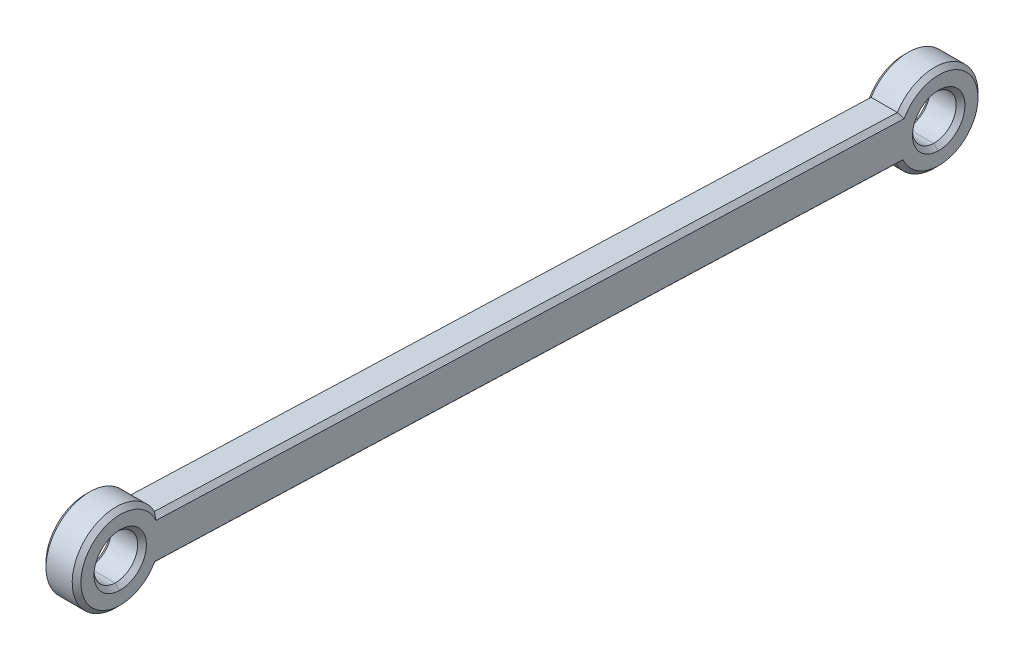
ISO-10303-21;
HEADER;
FILE_DESCRIPTION(('STEP AP214'),'2;1');
FILE_NAME('part.step','',(''),(''),'','','');
FILE_SCHEMA(('AUTOMOTIVE_DESIGN { 1 0 10303 214 1 1 1 1 }'));
ENDSEC;
DATA;
#1=APPLICATION_CONTEXT('core data for automotive mechanical design processes');
#2=APPLICATION_PROTOCOL_DEFINITION('international standard','automotive_design',2000,#1);
#3=PRODUCT_CONTEXT('',#1,'mechanical');
#4=PRODUCT('Part','Part','',(#3));
#5=PRODUCT_RELATED_PRODUCT_CATEGORY('part','',(#4));
#6=PRODUCT_DEFINITION_FORMATION('','',#4);
#7=PRODUCT_DEFINITION_CONTEXT('part definition',#1,'design');
#8=PRODUCT_DEFINITION('design','',#6,#7);
#9=PRODUCT_DEFINITION_SHAPE('','',#8);
#10=(LENGTH_UNIT() NAMED_UNIT(*) SI_UNIT(.MILLI.,.METRE.));
#11=(NAMED_UNIT(*) PLANE_ANGLE_UNIT() SI_UNIT($,.RADIAN.));
#12=(NAMED_UNIT(*) SI_UNIT($,.STERADIAN.) SOLID_ANGLE_UNIT());
#13=UNCERTAINTY_MEASURE_WITH_UNIT(LENGTH_MEASURE(1.E-05),#10,'distance_accuracy_value','');
#14=(GEOMETRIC_REPRESENTATION_CONTEXT(3) GLOBAL_UNCERTAINTY_ASSIGNED_CONTEXT((#13)) GLOBAL_UNIT_ASSIGNED_CONTEXT((#10,
#11,#12)) REPRESENTATION_CONTEXT('',''));
#15=CARTESIAN_POINT('',(0.,0.,0.));
#16=DIRECTION('',(0.,0.,1.));
#17=DIRECTION('',(1.,0.,0.));
#18=AXIS2_PLACEMENT_3D('',#15,#16,#17);
#19=CARTESIAN_POINT('',(108.5,18.26837005561,-729.2475213463));
#20=DIRECTION('',(1.,0.,0.));
#21=DIRECTION('',(0.,-0.999390827019096,0.0348994967024998));
#22=AXIS2_PLACEMENT_3D('',#19,#20,#21);
#23=CONICAL_SURFACE('',#22,5.5,0.7853981633973);
#24=DIRECTION('',(-0.707106781186443,0.706676030840843,-0.0246776707811115));
#25=VECTOR('',#24,1.);
#26=CARTESIAN_POINT('',(109.,12.2720250935,-729.0381243661));
#27=LINE('',#26,#25);
#28=CARTESIAN_POINT('',(109.,12.2720250935,-729.0381243661));
#29=VERTEX_POINT('',#28);
#30=CARTESIAN_POINT('',(108.,13.27141592051,-729.0730238628));
#31=VERTEX_POINT('',#30);
#32=EDGE_CURVE('E10',#29,#31,#27,.T.);
#33=ORIENTED_EDGE('',*,*,#32,.T.);
#34=CARTESIAN_POINT('',(108.,18.26837005561,-729.2475213463));
#35=DIRECTION('',(1.,0.,0.));
#36=DIRECTION('',(0.,0.999390827019096,-0.0348994967024998));
#37=AXIS2_PLACEMENT_3D('',#34,#35,#36);
#38=CIRCLE('',#37,5.);
#39=CARTESIAN_POINT('',(108.,23.26532419071,-729.4220188298));
#40=VERTEX_POINT('',#39);
#41=EDGE_CURVE('E214',#40,#31,#38,.T.);
#42=ORIENTED_EDGE('',*,*,#41,.F.);
#43=DIRECTION('',(-0.707106781186415,-0.706676030841115,0.0246776707741205));
#44=VECTOR('',#43,1.);
#45=CARTESIAN_POINT('',(109.,24.26471501773,-729.4569183265));
#46=LINE('',#45,#44);
#47=CARTESIAN_POINT('',(109.,24.26471501772,-729.4569183265));
#48=VERTEX_POINT('',#47);
#49=EDGE_CURVE('E25',#48,#40,#46,.T.);
#50=ORIENTED_EDGE('',*,*,#49,.F.);
#51=CARTESIAN_POINT('',(109.,18.26837005561,-729.2475213463));
#52=DIRECTION('',(1.,0.,0.));
#53=DIRECTION('',(0.,0.99939082701914,-0.0348994967012414));
#54=AXIS2_PLACEMENT_3D('',#51,#52,#53);
#55=CIRCLE('',#54,6.);
#56=EDGE_CURVE('E628',#48,#29,#55,.T.);
#57=ORIENTED_EDGE('',*,*,#56,.T.);
#58=EDGE_LOOP('',(#33,#42,#50,#57));
#59=FACE_BOUND('',#58,.T.);
#60=ADVANCED_FACE('F15',(#59),#23,.F.);
#61=CARTESIAN_POINT('',(108.5,18.26837005561,-729.2475213463));
#62=DIRECTION('',(1.,0.,0.));
#63=DIRECTION('',(0.,-0.999390827019096,0.0348994967024998));
#64=AXIS2_PLACEMENT_3D('',#61,#62,#63);
#65=CONICAL_SURFACE('',#64,5.5,0.7853981633973);
#66=ORIENTED_EDGE('',*,*,#49,.T.);
#67=CARTESIAN_POINT('',(108.,18.26837005561,-729.2475213463));
#68=DIRECTION('',(1.,0.,0.));
#69=DIRECTION('',(0.,-0.999390827019182,0.0348994967000194));
#70=AXIS2_PLACEMENT_3D('',#67,#68,#69);
#71=CIRCLE('',#70,5.);
#72=EDGE_CURVE('E212',#31,#40,#71,.T.);
#73=ORIENTED_EDGE('',*,*,#72,.F.);
#74=ORIENTED_EDGE('',*,*,#32,.F.);
#75=CARTESIAN_POINT('',(109.,18.26837005561,-729.2475213463));
#76=DIRECTION('',(1.,0.,0.));
#77=DIRECTION('',(0.,-0.999390827019138,0.0348994967012813));
#78=AXIS2_PLACEMENT_3D('',#75,#76,#77);
#79=CIRCLE('',#78,6.);
#80=EDGE_CURVE('E643',#29,#48,#79,.T.);
#81=ORIENTED_EDGE('',*,*,#80,.T.);
#82=EDGE_LOOP('',(#66,#73,#74,#81));
#83=FACE_BOUND('',#82,.T.);
#84=ADVANCED_FACE('F776',(#83),#65,.F.);
#85=CARTESIAN_POINT('',(109.,18.26837005561,-729.2475213463));
#86=DIRECTION('',(-1.,0.,0.));
#87=DIRECTION('',(0.,0.999390827019096,-0.0348994967024998));
#88=AXIS2_PLACEMENT_3D('',#85,#86,#87);
#89=CYLINDRICAL_SURFACE('',#88,5.);
#90=DIRECTION('',(1.,0.,9.473903143468E-13));
#91=VECTOR('',#90,1.);
#92=CARTESIAN_POINT('',(102.,13.27141592051,-729.0730238628));
#93=LINE('',#92,#91);
#94=CARTESIAN_POINT('',(102.,13.27141592051,-729.0730238628));
#95=VERTEX_POINT('',#94);
#96=EDGE_CURVE('E198',#95,#31,#93,.T.);
#97=ORIENTED_EDGE('',*,*,#96,.T.);
#98=ORIENTED_EDGE('',*,*,#72,.T.);
#99=DIRECTION('',(1.,0.,9.473903143468E-13));
#100=VECTOR('',#99,1.);
#101=CARTESIAN_POINT('',(102.,23.26532419071,-729.4220188298));
#102=LINE('',#101,#100);
#103=CARTESIAN_POINT('',(102.,23.26532419071,-729.4220188298));
#104=VERTEX_POINT('',#103);
#105=EDGE_CURVE('E207',#104,#40,#102,.T.);
#106=ORIENTED_EDGE('',*,*,#105,.F.);
#107=CARTESIAN_POINT('',(102.,18.26837005561,-729.2475213463));
#108=DIRECTION('',(-1.,0.,0.));
#109=DIRECTION('',(0.,0.999390827019096,-0.0348994967024998));
#110=AXIS2_PLACEMENT_3D('',#107,#108,#109);
#111=CIRCLE('',#110,5.);
#112=EDGE_CURVE('E210',#104,#95,#111,.T.);
#113=ORIENTED_EDGE('',*,*,#112,.T.);
#114=EDGE_LOOP('',(#97,#98,#106,#113));
#115=FACE_BOUND('',#114,.T.);
#116=ADVANCED_FACE('F208',(#115),#89,.F.);
#117=CARTESIAN_POINT('',(109.,18.26837005561,-729.2475213463));
#118=DIRECTION('',(-1.,0.,0.));
#119=DIRECTION('',(0.,0.999390827019096,-0.0348994967024998));
#120=AXIS2_PLACEMENT_3D('',#117,#118,#119);
#121=CYLINDRICAL_SURFACE('',#120,5.);
#122=ORIENTED_EDGE('',*,*,#105,.T.);
#123=ORIENTED_EDGE('',*,*,#41,.T.);
#124=ORIENTED_EDGE('',*,*,#96,.F.);
#125=CARTESIAN_POINT('',(102.,18.26837005561,-729.2475213463));
#126=DIRECTION('',(-1.,0.,0.));
#127=DIRECTION('',(0.,-0.999390827019182,0.0348994967000194));
#128=AXIS2_PLACEMENT_3D('',#125,#126,#127);
#129=CIRCLE('',#128,5.);
#130=EDGE_CURVE('E215',#95,#104,#129,.T.);
#131=ORIENTED_EDGE('',*,*,#130,.T.);
#132=EDGE_LOOP('',(#122,#123,#124,#131));
#133=FACE_BOUND('',#132,.T.);
#134=ADVANCED_FACE('F218',(#133),#121,.F.);
#135=CARTESIAN_POINT('',(101.5,18.26837005561,-729.2475213463));
#136=DIRECTION('',(-1.,0.,0.));
#137=DIRECTION('',(0.,0.999390827019096,-0.0348994967024998));
#138=AXIS2_PLACEMENT_3D('',#135,#136,#137);
#139=CONICAL_SURFACE('',#138,5.5,0.7853981633973);
#140=DIRECTION('',(0.70710678118667,-0.70667603084077,0.024677670776699));
#141=VECTOR('',#140,1.);
#142=CARTESIAN_POINT('',(101.,24.26471501772,-729.4569183265));
#143=LINE('',#142,#141);
#144=CARTESIAN_POINT('',(101.,24.26471501772,-729.4569183265));
#145=VERTEX_POINT('',#144);
#146=EDGE_CURVE('E221',#145,#104,#143,.T.);
#147=ORIENTED_EDGE('',*,*,#146,.T.);
#148=ORIENTED_EDGE('',*,*,#130,.F.);
#149=DIRECTION('',(0.707106781186686,0.706676030840686,-0.0246776707786295));
#150=VECTOR('',#149,1.);
#151=CARTESIAN_POINT('',(101.,12.2720250935,-729.0381243661));
#152=LINE('',#151,#150);
#153=CARTESIAN_POINT('',(101.,12.2720250935,-729.0381243661));
#154=VERTEX_POINT('',#153);
#155=EDGE_CURVE('E233',#154,#95,#152,.T.);
#156=ORIENTED_EDGE('',*,*,#155,.F.);
#157=CARTESIAN_POINT('',(101.,18.26837005561,-729.2475213463));
#158=DIRECTION('',(-1.,0.,0.));
#159=DIRECTION('',(0.,-0.999390827019138,0.0348994967012813));
#160=AXIS2_PLACEMENT_3D('',#157,#158,#159);
#161=CIRCLE('',#160,6.);
#162=EDGE_CURVE('E226',#154,#145,#161,.T.);
#163=ORIENTED_EDGE('',*,*,#162,.T.);
#164=EDGE_LOOP('',(#147,#148,#156,#163));
#165=FACE_BOUND('',#164,.T.);
#166=ADVANCED_FACE('F224',(#165),#139,.F.);
#167=CARTESIAN_POINT('',(101.5,18.26837005561,-729.2475213463));
#168=DIRECTION('',(-1.,0.,0.));
#169=DIRECTION('',(0.,0.999390827019096,-0.0348994967024998));
#170=AXIS2_PLACEMENT_3D('',#167,#168,#169);
#171=CONICAL_SURFACE('',#170,5.5,0.7853981633973);
#172=ORIENTED_EDGE('',*,*,#155,.T.);
#173=ORIENTED_EDGE('',*,*,#112,.F.);
#174=ORIENTED_EDGE('',*,*,#146,.F.);
#175=CARTESIAN_POINT('',(101.,18.26837005561,-729.2475213463));
#176=DIRECTION('',(-1.,0.,0.));
#177=DIRECTION('',(0.,0.99939082701914,-0.0348994967012414));
#178=AXIS2_PLACEMENT_3D('',#175,#176,#177);
#179=CIRCLE('',#178,6.);
#180=EDGE_CURVE('E658',#145,#154,#179,.T.);
#181=ORIENTED_EDGE('',*,*,#180,.T.);
#182=EDGE_LOOP('',(#172,#173,#174,#181));
#183=FACE_BOUND('',#182,.T.);
#184=ADVANCED_FACE('F232',(#183),#171,.F.);
#185=CARTESIAN_POINT('',(108.5,24.815515637,-541.7618021975));
#186=DIRECTION('',(1.,0.,0.));
#187=DIRECTION('',(0.,-0.999390827019096,0.0348994967024998));
#188=AXIS2_PLACEMENT_3D('',#185,#186,#187);
#189=CONICAL_SURFACE('',#188,5.5,0.7853981633973);
#190=DIRECTION('',(-0.707106781186397,0.706676030840897,-0.0246776707808699));
#191=VECTOR('',#190,1.);
#192=CARTESIAN_POINT('',(109.,18.81917067489,-541.5524052173));
#193=LINE('',#192,#191);
#194=CARTESIAN_POINT('',(109.,18.81917067489,-541.5524052173));
#195=VERTEX_POINT('',#194);
#196=CARTESIAN_POINT('',(108.,19.8185615019,-541.587304714));
#197=VERTEX_POINT('',#196);
#198=EDGE_CURVE('E718',#195,#197,#193,.T.);
#199=ORIENTED_EDGE('',*,*,#198,.T.);
#200=CARTESIAN_POINT('',(108.,24.815515637,-541.7618021975));
#201=DIRECTION('',(1.,0.,0.));
#202=DIRECTION('',(0.,0.999390827019096,-0.0348994967024998));
#203=AXIS2_PLACEMENT_3D('',#200,#201,#202);
#204=CIRCLE('',#203,5.);
#205=CARTESIAN_POINT('',(108.,29.8124697721,-541.936299681));
#206=VERTEX_POINT('',#205);
#207=EDGE_CURVE('E693',#206,#197,#204,.T.);
#208=ORIENTED_EDGE('',*,*,#207,.F.);
#209=DIRECTION('',(-0.707106781186415,-0.706676030841115,0.0246776707741205));
#210=VECTOR('',#209,1.);
#211=CARTESIAN_POINT('',(109.,30.81186059912,-541.9711991777));
#212=LINE('',#211,#210);
#213=CARTESIAN_POINT('',(109.,30.81186059911,-541.9711991777));
#214=VERTEX_POINT('',#213);
#215=EDGE_CURVE('E727',#214,#206,#212,.T.);
#216=ORIENTED_EDGE('',*,*,#215,.F.);
#217=CARTESIAN_POINT('',(109.,24.815515637,-541.7618021975));
#218=DIRECTION('',(1.,0.,0.));
#219=DIRECTION('',(0.,0.999390827019138,-0.0348994967012813));
#220=AXIS2_PLACEMENT_3D('',#217,#218,#219);
#221=CIRCLE('',#220,6.);
#222=EDGE_CURVE('E292',#214,#195,#221,.T.);
#223=ORIENTED_EDGE('',*,*,#222,.T.);
#224=EDGE_LOOP('',(#199,#208,#216,#223));
#225=FACE_BOUND('',#224,.T.);
#226=ADVANCED_FACE('F719',(#225),#189,.F.);
#227=CARTESIAN_POINT('',(109.,24.815515637,-541.7618021975));
#228=DIRECTION('',(-1.,0.,0.));
#229=DIRECTION('',(0.,0.999390827019096,-0.0348994967024998));
#230=AXIS2_PLACEMENT_3D('',#227,#228,#229);
#231=CYLINDRICAL_SURFACE('',#230,5.);
#232=DIRECTION('',(1.,0.,9.094947017729E-13));
#233=VECTOR('',#232,1.);
#234=CARTESIAN_POINT('',(102.,19.8185615019,-541.587304714));
#235=LINE('',#234,#233);
#236=CARTESIAN_POINT('',(102.,19.8185615019,-541.587304714));
#237=VERTEX_POINT('',#236);
#238=EDGE_CURVE('E239',#237,#197,#235,.T.);
#239=ORIENTED_EDGE('',*,*,#238,.T.);
#240=CARTESIAN_POINT('',(108.,24.815515637,-541.7618021975));
#241=DIRECTION('',(1.,0.,0.));
#242=DIRECTION('',(0.,-0.999390827019181,0.0348994967000593));
#243=AXIS2_PLACEMENT_3D('',#240,#241,#242);
#244=CIRCLE('',#243,5.);
#245=EDGE_CURVE('E705',#197,#206,#244,.T.);
#246=ORIENTED_EDGE('',*,*,#245,.T.);
#247=DIRECTION('',(1.,0.,9.473903143468E-13));
#248=VECTOR('',#247,1.);
#249=CARTESIAN_POINT('',(102.,29.8124697721,-541.936299681));
#250=LINE('',#249,#248);
#251=CARTESIAN_POINT('',(102.,29.8124697721,-541.936299681));
#252=VERTEX_POINT('',#251);
#253=EDGE_CURVE('E689',#252,#206,#250,.T.);
#254=ORIENTED_EDGE('',*,*,#253,.F.);
#255=CARTESIAN_POINT('',(102.,24.815515637,-541.7618021975));
#256=DIRECTION('',(-1.,0.,0.));
#257=DIRECTION('',(0.,0.999390827019096,-0.0348994967024998));
#258=AXIS2_PLACEMENT_3D('',#255,#256,#257);
#259=CIRCLE('',#258,5.);
#260=EDGE_CURVE('E677',#252,#237,#259,.T.);
#261=ORIENTED_EDGE('',*,*,#260,.T.);
#262=EDGE_LOOP('',(#239,#246,#254,#261));
#263=FACE_BOUND('',#262,.T.);
#264=ADVANCED_FACE('F702',(#263),#231,.F.);
#265=CARTESIAN_POINT('',(109.,24.815515637,-541.7618021975));
#266=DIRECTION('',(-1.,0.,0.));
#267=DIRECTION('',(0.,0.999390827019096,-0.0348994967024998));
#268=AXIS2_PLACEMENT_3D('',#265,#266,#267);
#269=CYLINDRICAL_SURFACE('',#268,5.);
#270=ORIENTED_EDGE('',*,*,#253,.T.);
#271=ORIENTED_EDGE('',*,*,#207,.T.);
#272=ORIENTED_EDGE('',*,*,#238,.F.);
#273=CARTESIAN_POINT('',(102.,24.815515637,-541.7618021975));
#274=DIRECTION('',(-1.,0.,0.));
#275=DIRECTION('',(0.,-0.999390827019181,0.0348994967000593));
#276=AXIS2_PLACEMENT_3D('',#273,#274,#275);
#277=CIRCLE('',#276,5.);
#278=EDGE_CURVE('E685',#237,#252,#277,.T.);
#279=ORIENTED_EDGE('',*,*,#278,.T.);
#280=EDGE_LOOP('',(#270,#271,#272,#279));
#281=FACE_BOUND('',#280,.T.);
#282=ADVANCED_FACE('F445',(#281),#269,.F.);
#283=CARTESIAN_POINT('',(101.5,24.815515637,-541.7618021975));
#284=DIRECTION('',(-1.,0.,0.));
#285=DIRECTION('',(0.,0.999390827019096,-0.0348994967024998));
#286=AXIS2_PLACEMENT_3D('',#283,#284,#285);
#287=CONICAL_SURFACE('',#286,5.5,0.7853981633973);
#288=DIRECTION('',(0.707106781186671,-0.706676030840771,0.024677670776619));
#289=VECTOR('',#288,1.);
#290=CARTESIAN_POINT('',(101.,30.81186059911,-541.9711991777));
#291=LINE('',#290,#289);
#292=CARTESIAN_POINT('',(101.,30.81186059911,-541.9711991777));
#293=VERTEX_POINT('',#292);
#294=EDGE_CURVE('E681',#293,#252,#291,.T.);
#295=ORIENTED_EDGE('',*,*,#294,.T.);
#296=ORIENTED_EDGE('',*,*,#278,.F.);
#297=DIRECTION('',(0.707106781186687,0.706676030840687,-0.0246776707785495));
#298=VECTOR('',#297,1.);
#299=CARTESIAN_POINT('',(101.,18.81917067489,-541.5524052173));
#300=LINE('',#299,#298);
#301=CARTESIAN_POINT('',(101.,18.81917067489,-541.5524052173));
#302=VERTEX_POINT('',#301);
#303=EDGE_CURVE('E363',#302,#237,#300,.T.);
#304=ORIENTED_EDGE('',*,*,#303,.F.);
#305=CARTESIAN_POINT('',(101.,24.815515637,-541.7618021975));
#306=DIRECTION('',(-1.,0.,0.));
#307=DIRECTION('',(0.,-0.99939082701914,0.0348994967012414));
#308=AXIS2_PLACEMENT_3D('',#305,#306,#307);
#309=CIRCLE('',#308,6.);
#310=EDGE_CURVE('E463',#302,#293,#309,.T.);
#311=ORIENTED_EDGE('',*,*,#310,.T.);
#312=EDGE_LOOP('',(#295,#296,#304,#311));
#313=FACE_BOUND('',#312,.T.);
#314=ADVANCED_FACE('F507',(#313),#287,.F.);
#315=CARTESIAN_POINT('',(101.5,24.815515637,-541.7618021975));
#316=DIRECTION('',(-1.,0.,0.));
#317=DIRECTION('',(0.,0.999390827019096,-0.0348994967024998));
#318=AXIS2_PLACEMENT_3D('',#315,#316,#317);
#319=CONICAL_SURFACE('',#318,5.5,0.7853981633973);
#320=ORIENTED_EDGE('',*,*,#303,.T.);
#321=ORIENTED_EDGE('',*,*,#260,.F.);
#322=ORIENTED_EDGE('',*,*,#294,.F.);
#323=CARTESIAN_POINT('',(101.,24.815515637,-541.7618021975));
#324=DIRECTION('',(-1.,0.,0.));
#325=DIRECTION('',(0.,0.999390827019138,-0.0348994967012813));
#326=AXIS2_PLACEMENT_3D('',#323,#324,#325);
#327=CIRCLE('',#326,6.);
#328=EDGE_CURVE('E631',#293,#302,#327,.T.);
#329=ORIENTED_EDGE('',*,*,#328,.T.);
#330=EDGE_LOOP('',(#320,#321,#322,#329));
#331=FACE_BOUND('',#330,.T.);
#332=ADVANCED_FACE('F443',(#331),#319,.F.);
#333=CARTESIAN_POINT('',(101.5,24.815515637,-541.7618021975));
#334=DIRECTION('',(1.,0.,0.));
#335=DIRECTION('',(0.,-0.999390827019096,0.0348994967024998));
#336=AXIS2_PLACEMENT_3D('',#333,#334,#335);
#337=CONICAL_SURFACE('',#336,9.5,0.7853981633973);
#338=CARTESIAN_POINT('',(101.,24.815515637,-541.7618021975));
#339=DIRECTION('',(1.,0.,0.));
#340=DIRECTION('',(0.,0.999390827019139,-0.0348994967012514));
#341=AXIS2_PLACEMENT_3D('',#338,#339,#340);
#342=CIRCLE('',#341,9.);
#343=CARTESIAN_POINT('',(101.,33.81003308017,-542.0758976678));
#344=VERTEX_POINT('',#343);
#345=CARTESIAN_POINT('',(101.,29.09444768278,-533.8440537456));
#346=VERTEX_POINT('',#345);
#347=EDGE_CURVE('E469',#344,#346,#342,.T.);
#348=ORIENTED_EDGE('',*,*,#347,.T.);
#349=CARTESIAN_POINT('',(101.,24.815515637,-541.7618021975));
#350=DIRECTION('',(1.,0.,0.));
#351=DIRECTION('',(0.,0.475436893975477,0.879749827989157));
#352=AXIS2_PLACEMENT_3D('',#349,#350,#351);
#353=CIRCLE('',#352,9.);
#354=CARTESIAN_POINT('',(101.,15.82099819383,-541.4477067272));
#355=VERTEX_POINT('',#354);
#356=EDGE_CURVE('E370',#346,#355,#353,.T.);
#357=ORIENTED_EDGE('',*,*,#356,.T.);
#358=CARTESIAN_POINT('',(101.,24.815515637,-541.7618021975));
#359=DIRECTION('',(1.,0.,0.));
#360=DIRECTION('',(0.,-0.999390827019139,0.0348994967012514));
#361=AXIS2_PLACEMENT_3D('',#358,#359,#360);
#362=CIRCLE('',#361,9.);
#363=CARTESIAN_POINT('',(101.,20.53658359123,-549.6795506494));
#364=VERTEX_POINT('',#363);
#365=EDGE_CURVE('E367',#355,#364,#362,.T.);
#366=ORIENTED_EDGE('',*,*,#365,.T.);
#367=CARTESIAN_POINT('',(100.999999999997,20.5365835912284,-549.679550649403));
#368=CARTESIAN_POINT('',(101.039830806248,20.4959150001214,-549.702847528269));
#369=CARTESIAN_POINT('',(101.079691222546,20.455220518765,-549.726048546688));
#370=CARTESIAN_POINT('',(101.159927563062,20.373313357865,-549.772527932685));
#371=CARTESIAN_POINT('',(101.200304149938,20.3321000947896,-549.795804128106));
#372=CARTESIAN_POINT('',(101.281572816408,20.2491550114269,-549.842431121777));
#373=CARTESIAN_POINT('',(101.32246554421,20.2074226159809,-549.865779766889));
#374=CARTESIAN_POINT('',(101.404766514659,20.1234390988574,-549.912549074704));
#375=CARTESIAN_POINT('',(101.4461753923,20.0811874119034,-549.935967604814));
#376=CARTESIAN_POINT('',(101.529508672888,19.9961653041049,-549.982874264159));
#377=CARTESIAN_POINT('',(101.571433698245,19.9533943289992,-550.006360282851));
#378=CARTESIAN_POINT('',(101.655799288797,19.8673338021143,-550.053399670708));
#379=CARTESIAN_POINT('',(101.698240464582,19.824043708219,-550.076950952836));
#380=CARTESIAN_POINT('',(101.783638361536,19.7369452584169,-550.124118795071));
#381=CARTESIAN_POINT('',(101.826595682055,19.6931363735466,-550.147733293088));
#382=CARTESIAN_POINT('',(101.913025902117,19.6050008178253,-550.195025665464));
#383=CARTESIAN_POINT('',(101.956499390714,19.5606736321759,-550.218701503986));
#384=CARTESIAN_POINT('',(102.000000000012,19.5163229946864,-550.24228315909));
#385=B_SPLINE_CURVE_WITH_KNOTS('',3,(#367,#368,#369,#370,#371,#372,#373,#374,#375,#376,#377,
#378,#379,#380,#381,#382,#383,#384),.UNSPECIFIED.,.F.,.F.,(4,2,2,2,2,2,2,2,4),(0.,
0.184522377111853,0.371164064490977,0.559924703325838,0.750803781909197,0.943800641002774,
1.13891447902569,1.33614435708425,1.53548920385862),.UNSPECIFIED.);
#386=CARTESIAN_POINT('',(102.,19.51632299468,-550.2422831591));
#387=VERTEX_POINT('',#386);
#388=EDGE_CURVE('E409',#364,#387,#385,.T.);
#389=ORIENTED_EDGE('',*,*,#388,.T.);
#390=CARTESIAN_POINT('',(102.,24.815515637,-541.7618021975));
#391=DIRECTION('',(1.,0.,0.));
#392=DIRECTION('',(0.,-0.999390827019139,0.0348994967012613));
#393=AXIS2_PLACEMENT_3D('',#390,#391,#392);
#394=CIRCLE('',#393,10.);
#395=CARTESIAN_POINT('',(102.,14.82160736681,-541.4128072305));
#396=VERTEX_POINT('',#395);
#397=EDGE_CURVE('E360',#396,#387,#394,.T.);
#398=ORIENTED_EDGE('',*,*,#397,.F.);
#399=CARTESIAN_POINT('',(102.,24.815515637,-541.7618021975));
#400=DIRECTION('',(1.,0.,0.));
#401=DIRECTION('',(0.,0.999390827019096,-0.0348994967024998));
#402=AXIS2_PLACEMENT_3D('',#399,#400,#401);
#403=CIRCLE('',#402,10.);
#404=CARTESIAN_POINT('',(102.,34.80942390719,-542.1107971645));
#405=VERTEX_POINT('',#404);
#406=EDGE_CURVE('E364',#405,#396,#403,.T.);
#407=ORIENTED_EDGE('',*,*,#406,.F.);
#408=CARTESIAN_POINT('',(102.,24.815515637,-541.7618021975));
#409=DIRECTION('',(1.,0.,0.));
#410=DIRECTION('',(0.,0.469471562786304,-0.882947592858707));
#411=AXIS2_PLACEMENT_3D('',#408,#409,#410);
#412=CIRCLE('',#411,10.);
#413=CARTESIAN_POINT('',(102.,29.51023421348,-550.5912724198));
#414=VERTEX_POINT('',#413);
#415=EDGE_CURVE('E304',#414,#405,#412,.T.);
#416=ORIENTED_EDGE('',*,*,#415,.F.);
#417=CARTESIAN_POINT('',(101.000000474716,28.5317107496033,-549.958744698132));
#418=CARTESIAN_POINT('',(101.482031156501,29.0030148443229,-550.274327839056));
#419=CARTESIAN_POINT('',(102.000001373837,29.5102328404799,-550.591272371854));
#420=B_SPLINE_CURVE_WITH_KNOTS('',2,(#417,#418,#419),.UNSPECIFIED.,.F.,.F.,(3,3),(0.,1.),.UNSPECIFIED.);
#421=CARTESIAN_POINT('',(101.,28.53171122403,-549.9587447147));
#422=VERTEX_POINT('',#421);
#423=EDGE_CURVE('E482',#422,#414,#420,.T.);
#424=ORIENTED_EDGE('',*,*,#423,.F.);
#425=CARTESIAN_POINT('',(101.,24.815515637,-541.7618021975));
#426=DIRECTION('',(1.,0.,0.));
#427=DIRECTION('',(0.,0.4129105078199,-0.910771602835701));
#428=AXIS2_PLACEMENT_3D('',#425,#426,#427);
#429=CIRCLE('',#428,9.);
#430=EDGE_CURVE('E464',#422,#344,#429,.T.);
#431=ORIENTED_EDGE('',*,*,#430,.T.);
#432=EDGE_LOOP('',(#348,#357,#366,#389,#398,#407,#416,#424,#431));
#433=FACE_BOUND('',#432,.T.);
#434=ADVANCED_FACE('F433',(#433),#337,.T.);
#435=CARTESIAN_POINT('',(109.,24.815515637,-541.7618021975));
#436=DIRECTION('',(-1.,0.,0.));
#437=DIRECTION('',(0.,0.999390827019096,-0.0348994967024998));
#438=AXIS2_PLACEMENT_3D('',#435,#436,#437);
#439=CYLINDRICAL_SURFACE('',#438,10.);
#440=CARTESIAN_POINT('',(108.,24.815515637,-541.7618021975));
#441=DIRECTION('',(-1.,0.,0.));
#442=DIRECTION('',(0.,0.999390827019096,-0.0348994967024998));
#443=AXIS2_PLACEMENT_3D('',#440,#441,#442);
#444=CIRCLE('',#443,10.);
#445=CARTESIAN_POINT('',(108.,34.80942390719,-542.1107971645));
#446=VERTEX_POINT('',#445);
#447=CARTESIAN_POINT('',(108.,29.51023126486,-550.5912781261));
#448=VERTEX_POINT('',#447);
#449=EDGE_CURVE('E579',#446,#448,#444,.T.);
#450=ORIENTED_EDGE('',*,*,#449,.T.);
#451=DIRECTION('',(0.999999999999427,-4.91436354129313E-07,-9.51043602981225E-07));
#452=VECTOR('',#451,1.);
#453=CARTESIAN_POINT('',(102.,29.51023421348,-550.5912724198));
#454=LINE('',#453,#452);
#455=EDGE_CURVE('E481',#414,#448,#454,.T.);
#456=ORIENTED_EDGE('',*,*,#455,.F.);
#457=ORIENTED_EDGE('',*,*,#415,.T.);
#458=ORIENTED_EDGE('',*,*,#406,.T.);
#459=ORIENTED_EDGE('',*,*,#397,.T.);
#460=DIRECTION('',(-0.999999999999427,4.23913251760511E-07,-9.83043624576426E-07));
#461=VECTOR('',#460,1.);
#462=CARTESIAN_POINT('',(108.,19.5163204512,-550.2422772608));
#463=LINE('',#462,#461);
#464=CARTESIAN_POINT('',(108.,19.5163204512,-550.2422772608));
#465=VERTEX_POINT('',#464);
#466=EDGE_CURVE('E353',#465,#387,#463,.T.);
#467=ORIENTED_EDGE('',*,*,#466,.F.);
#468=CARTESIAN_POINT('',(108.,24.815515637,-541.7618021975));
#469=DIRECTION('',(-1.,0.,0.));
#470=DIRECTION('',(0.,-0.529919264231496,-0.848048096157494));
#471=AXIS2_PLACEMENT_3D('',#468,#469,#470);
#472=CIRCLE('',#471,10.);
#473=CARTESIAN_POINT('',(108.,14.82160736681,-541.4128072305));
#474=VERTEX_POINT('',#473);
#475=EDGE_CURVE('E301',#465,#474,#472,.T.);
#476=ORIENTED_EDGE('',*,*,#475,.T.);
#477=CARTESIAN_POINT('',(108.,24.815515637,-541.7618021975));
#478=DIRECTION('',(-1.,0.,0.));
#479=DIRECTION('',(0.,-0.999390827019096,0.0348994967025099));
#480=AXIS2_PLACEMENT_3D('',#477,#478,#479);
#481=CIRCLE('',#480,10.);
#482=EDGE_CURVE('E305',#474,#446,#481,.T.);
#483=ORIENTED_EDGE('',*,*,#482,.T.);
#484=EDGE_LOOP('',(#450,#456,#457,#458,#459,#467,#476,#483));
#485=FACE_BOUND('',#484,.T.);
#486=ADVANCED_FACE('F271',(#485),#439,.T.);
#487=CARTESIAN_POINT('',(108.5,24.815515637,-541.7618021975));
#488=DIRECTION('',(-1.,0.,0.));
#489=DIRECTION('',(0.,0.999390827019096,-0.0348994967024998));
#490=AXIS2_PLACEMENT_3D('',#487,#488,#489);
#491=CONICAL_SURFACE('',#490,9.5,0.7853981633973);
#492=CARTESIAN_POINT('',(109.,24.815515637,-541.7618021975));
#493=DIRECTION('',(-1.,0.,0.));
#494=DIRECTION('',(0.,-0.475436893974494,-0.879749827989688));
#495=AXIS2_PLACEMENT_3D('',#492,#493,#494);
#496=CIRCLE('',#495,9.);
#497=CARTESIAN_POINT('',(109.,20.53658271031,-549.6795486751));
#498=VERTEX_POINT('',#497);
#499=CARTESIAN_POINT('',(109.,15.82099819383,-541.4477067272));
#500=VERTEX_POINT('',#499);
#501=EDGE_CURVE('E293',#498,#500,#496,.T.);
#502=ORIENTED_EDGE('',*,*,#501,.T.);
#503=CARTESIAN_POINT('',(109.,24.815515637,-541.7618021975));
#504=DIRECTION('',(-1.,0.,0.));
#505=DIRECTION('',(0.,-0.99939082701914,0.0348994967012314));
#506=AXIS2_PLACEMENT_3D('',#503,#504,#505);
#507=CIRCLE('',#506,9.);
#508=CARTESIAN_POINT('',(109.,21.09932106662,-533.564857772));
#509=VERTEX_POINT('',#508);
#510=EDGE_CURVE('E298',#500,#509,#507,.T.);
#511=ORIENTED_EDGE('',*,*,#510,.T.);
#512=CARTESIAN_POINT('',(109.,24.815515637,-541.7618021975));
#513=DIRECTION('',(-1.,0.,0.));
#514=DIRECTION('',(0.,-0.412910507819697,0.910771602835793));
#515=AXIS2_PLACEMENT_3D('',#512,#513,#514);
#516=CIRCLE('',#515,9.);
#517=CARTESIAN_POINT('',(109.,33.81003308017,-542.0758976678));
#518=VERTEX_POINT('',#517);
#519=EDGE_CURVE('E571',#509,#518,#516,.T.);
#520=ORIENTED_EDGE('',*,*,#519,.T.);
#521=CARTESIAN_POINT('',(109.,24.815515637,-541.7618021975));
#522=DIRECTION('',(-1.,0.,0.));
#523=DIRECTION('',(0.,0.999390827019139,-0.0348994967012613));
#524=AXIS2_PLACEMENT_3D('',#521,#522,#523);
#525=CIRCLE('',#524,9.);
#526=CARTESIAN_POINT('',(109.,28.53171020738,-549.958746623));
#527=VERTEX_POINT('',#526);
#528=EDGE_CURVE('E563',#518,#527,#525,.T.);
#529=ORIENTED_EDGE('',*,*,#528,.T.);
#530=CARTESIAN_POINT('',(109.00000000001,28.5317102073839,-549.958746623009));
#531=CARTESIAN_POINT('',(108.960169193744,28.5706546237292,-549.984823649371));
#532=CARTESIAN_POINT('',(108.920308777433,28.6096315541445,-550.01080685481));
#533=CARTESIAN_POINT('',(108.840072436894,28.6880969552527,-550.0628865741));
#534=CARTESIAN_POINT('',(108.799695850008,28.7275861595777,-550.088980961793));
#535=CARTESIAN_POINT('',(108.718427183523,28.8070766582295,-550.141280330996));
#536=CARTESIAN_POINT('',(108.677534455715,28.8470786765092,-550.167483204735));
#537=CARTESIAN_POINT('',(108.595233485258,28.9275951520153,-550.219996978881));
#538=CARTESIAN_POINT('',(108.553824607615,28.9681103219034,-550.246305791323));
#539=CARTESIAN_POINT('',(108.470491327027,29.0496532769701,-550.299029030833));
#540=CARTESIAN_POINT('',(108.428566301673,29.0906817622837,-550.325441391164));
#541=CARTESIAN_POINT('',(108.344200711128,29.1732513482257,-550.378369472312));
#542=CARTESIAN_POINT('',(108.301759535349,29.2147931352338,-550.404883148992));
#543=CARTESIAN_POINT('',(108.21636163841,29.2983891552388,-550.458011773445));
#544=CARTESIAN_POINT('',(108.173404317901,29.340444059755,-550.484624701049));
#545=CARTESIAN_POINT('',(108.086974097863,29.4250659725562,-550.537949897137));
#546=CARTESIAN_POINT('',(108.043500609279,29.4676336363986,-550.564660170653));
#547=CARTESIAN_POINT('',(107.999999999995,29.5102312648576,-550.591278126096));
#548=B_SPLINE_CURVE_WITH_KNOTS('',3,(#530,#531,#532,#533,#534,#535,#536,#537,#538,#539,#540,
#541,#542,#543,#544,#545,#546,#547),.UNSPECIFIED.,.F.,.F.,(4,2,2,2,2,2,2,2,4),(0.,
0.184522377160062,0.371164064573815,0.559924703429622,0.750803782020201,0.943800641107134,
1.13891447910955,1.3361443571337,1.53548920385968),.UNSPECIFIED.);
#549=EDGE_CURVE('E253',#527,#448,#548,.T.);
#550=ORIENTED_EDGE('',*,*,#549,.T.);
#551=ORIENTED_EDGE('',*,*,#449,.F.);
#552=ORIENTED_EDGE('',*,*,#482,.F.);
#553=ORIENTED_EDGE('',*,*,#475,.F.);
#554=CARTESIAN_POINT('',(108.999999525359,20.536583184662,-549.679548691665));
#555=CARTESIAN_POINT('',(108.517968849201,20.0444132016982,-549.961486572715));
#556=CARTESIAN_POINT('',(107.999998626115,19.5163218242478,-550.242277308748));
#557=B_SPLINE_CURVE_WITH_KNOTS('',2,(#554,#555,#556),.UNSPECIFIED.,.F.,.F.,(3,3),(0.,1.),.UNSPECIFIED.);
#558=EDGE_CURVE('E313',#498,#465,#557,.T.);
#559=ORIENTED_EDGE('',*,*,#558,.F.);
#560=EDGE_LOOP('',(#502,#511,#520,#529,#550,#551,#552,#553,#559));
#561=FACE_BOUND('',#560,.T.);
#562=ADVANCED_FACE('F260',(#561),#491,.T.);
#563=CARTESIAN_POINT('',(109.,22.26593336369,-729.3871193331));
#564=DIRECTION('',(0.707106781186591,0.706676030840791,-0.0246776707783297));
#565=DIRECTION('',(0.,-0.0348994967024942,-0.999390827019096));
#566=AXIS2_PLACEMENT_3D('',#563,#564,#565);
#567=PLANE('',#566);
#568=ORIENTED_EDGE('',*,*,#549,.F.);
#569=DIRECTION('',(0.,-0.0348994967025398,-0.999390827019094));
#570=VECTOR('',#569,1.);
#571=CARTESIAN_POINT('',(109.,28.53171020738,-549.958746623));
#572=LINE('',#571,#570);
#573=CARTESIAN_POINT('',(109.,22.54730210139,-721.3297728944));
#574=VERTEX_POINT('',#573);
#575=EDGE_CURVE('E528',#527,#574,#572,.T.);
#576=ORIENTED_EDGE('',*,*,#575,.T.);
#577=CARTESIAN_POINT('',(107.999999999985,23.5675626979322,-720.767040384712));
#578=CARTESIAN_POINT('',(108.043500609051,23.5232120606813,-720.790622039693));
#579=CARTESIAN_POINT('',(108.086974097417,23.478884875268,-720.814297878086));
#580=CARTESIAN_POINT('',(108.17340431708,23.3907493199471,-720.861590250238));
#581=CARTESIAN_POINT('',(108.216361637433,23.3469404352411,-720.885204748159));
#582=CARTESIAN_POINT('',(108.301759534121,23.2598419856979,-720.932372590236));
#583=CARTESIAN_POINT('',(108.344200709807,23.2165518918972,-720.955923872302));
#584=CARTESIAN_POINT('',(108.428566300227,23.1304913651338,-721.002963260072));
#585=CARTESIAN_POINT('',(108.47049132555,23.0877203900552,-721.026449278739));
#586=CARTESIAN_POINT('',(108.553824606138,23.0026982822452,-721.073355938071));
#587=CARTESIAN_POINT('',(108.595233483812,22.9604465952528,-721.096774468195));
#588=CARTESIAN_POINT('',(108.677534454393,22.8764630779891,-721.143543776078));
#589=CARTESIAN_POINT('',(108.718427182295,22.8347306824415,-721.166892421244));
#590=CARTESIAN_POINT('',(108.799695849031,22.7517855988145,-721.213519415066));
#591=CARTESIAN_POINT('',(108.840072436072,22.7105723355764,-721.236795610586));
#592=CARTESIAN_POINT('',(108.920308776986,22.6286651742923,-721.283274996823));
#593=CARTESIAN_POINT('',(108.960169193516,22.5879706927145,-721.306476015385));
#594=CARTESIAN_POINT('',(109.000000000001,22.5473021013904,-721.329772894399));
#595=B_SPLINE_CURVE_WITH_KNOTS('',3,(#577,#578,#579,#580,#581,#582,#583,#584,#585,#586,#587,
#588,#589,#590,#591,#592,#593,#594),.UNSPECIFIED.,.F.,.F.,(4,2,2,2,2,2,2,2,4),(0.,
0.199344845709311,0.396574723010628,0.591688560582441,0.784685419529287,0.975564498268569,
1.1643251375601,1.35096682569488,1.53548920385936),.UNSPECIFIED.);
#596=CARTESIAN_POINT('',(108.,23.56756269794,-720.7670403847));
#597=VERTEX_POINT('',#596);
#598=EDGE_CURVE('E542',#597,#574,#595,.T.);
#599=ORIENTED_EDGE('',*,*,#598,.F.);
#600=DIRECTION('',(0.,0.0348994967025598,0.999390827019094));
#601=VECTOR('',#600,1.);
#602=CARTESIAN_POINT('',(108.,23.56756269794,-720.7670403847));
#603=LINE('',#602,#601);
#604=EDGE_CURVE('E536',#597,#448,#603,.T.);
#605=ORIENTED_EDGE('',*,*,#604,.T.);
#606=EDGE_LOOP('',(#568,#576,#599,#605));
#607=FACE_BOUND('',#606,.T.);
#608=ADVANCED_FACE('F270',(#607),#567,.T.);
#609=CARTESIAN_POINT('',(108.5,18.26837005561,-729.2475213463));
#610=DIRECTION('',(-1.,0.,0.));
#611=DIRECTION('',(0.,0.999390827019096,-0.0348994967024998));
#612=AXIS2_PLACEMENT_3D('',#609,#610,#611);
#613=CONICAL_SURFACE('',#612,9.5,0.7853981633973);
#614=CARTESIAN_POINT('',(108.000000327333,13.5736548031667,-720.418044046676));
#615=CARTESIAN_POINT('',(108.518055657411,14.0809561263097,-720.735041202505));
#616=CARTESIAN_POINT('',(109.00000181248,14.5521775554636,-721.050569571645));
#617=B_SPLINE_CURVE_WITH_KNOTS('',2,(#614,#615,#616),.UNSPECIFIED.,.F.,.F.,(3,3),(0.,1.),.UNSPECIFIED.);
#618=CARTESIAN_POINT('',(108.,13.5736551303,-720.4180440581));
#619=VERTEX_POINT('',#618);
#620=CARTESIAN_POINT('',(109.,14.55217936684,-721.0505696349));
#621=VERTEX_POINT('',#620);
#622=EDGE_CURVE('E321',#619,#621,#617,.T.);
#623=ORIENTED_EDGE('',*,*,#622,.F.);
#624=CARTESIAN_POINT('',(108.,18.26837005561,-729.2475213463));
#625=DIRECTION('',(-1.,0.,0.));
#626=DIRECTION('',(0.,-0.999390827019161,0.0348994967006286));
#627=AXIS2_PLACEMENT_3D('',#624,#625,#626);
#628=CIRCLE('',#627,10.);
#629=CARTESIAN_POINT('',(108.,8.274461785418,-728.8985263793));
#630=VERTEX_POINT('',#629);
#631=EDGE_CURVE('E543',#630,#619,#628,.T.);
#632=ORIENTED_EDGE('',*,*,#631,.F.);
#633=CARTESIAN_POINT('',(108.,18.26837005561,-729.2475213463));
#634=DIRECTION('',(-1.,0.,0.));
#635=DIRECTION('',(0.,0.999390827019096,-0.0348994967024998));
#636=AXIS2_PLACEMENT_3D('',#633,#634,#635);
#637=CIRCLE('',#636,10.);
#638=CARTESIAN_POINT('',(108.,28.2622783258,-729.5965163133));
#639=VERTEX_POINT('',#638);
#640=EDGE_CURVE('E535',#639,#630,#637,.T.);
#641=ORIENTED_EDGE('',*,*,#640,.F.);
#642=CARTESIAN_POINT('',(108.,18.26837005561,-729.2475213463));
#643=DIRECTION('',(-1.,0.,0.));
#644=DIRECTION('',(0.,0.529919264232179,0.848048096157067));
#645=AXIS2_PLACEMENT_3D('',#642,#643,#644);
#646=CIRCLE('',#645,10.);
#647=EDGE_CURVE('E539',#597,#639,#646,.T.);
#648=ORIENTED_EDGE('',*,*,#647,.F.);
#649=ORIENTED_EDGE('',*,*,#598,.T.);
#650=CARTESIAN_POINT('',(109.,18.26837005561,-729.2475213463));
#651=DIRECTION('',(-1.,0.,0.));
#652=DIRECTION('',(0.,0.475436893975596,0.879749827989093));
#653=AXIS2_PLACEMENT_3D('',#650,#651,#652);
#654=CIRCLE('',#653,9.);
#655=CARTESIAN_POINT('',(109.,27.26288749878,-729.5616168166));
#656=VERTEX_POINT('',#655);
#657=EDGE_CURVE('E524',#574,#656,#654,.T.);
#658=ORIENTED_EDGE('',*,*,#657,.T.);
#659=CARTESIAN_POINT('',(109.,18.26837005561,-729.2475213463));
#660=DIRECTION('',(-1.,0.,0.));
#661=DIRECTION('',(0.,0.999390827019096,-0.0348994967024998));
#662=AXIS2_PLACEMENT_3D('',#659,#660,#661);
#663=CIRCLE('',#662,9.);
#664=CARTESIAN_POINT('',(109.,13.98943800983,-737.1652697982));
#665=VERTEX_POINT('',#664);
#666=EDGE_CURVE('E529',#656,#665,#663,.T.);
#667=ORIENTED_EDGE('',*,*,#666,.T.);
#668=CARTESIAN_POINT('',(109.,18.26837005561,-729.2475213463));
#669=DIRECTION('',(-1.,0.,0.));
#670=DIRECTION('',(0.,-0.475436893975322,-0.879749827989241));
#671=AXIS2_PLACEMENT_3D('',#668,#669,#670);
#672=CIRCLE('',#671,9.);
#673=CARTESIAN_POINT('',(109.,9.273852612438,-728.933425876));
#674=VERTEX_POINT('',#673);
#675=EDGE_CURVE('E617',#665,#674,#672,.T.);
#676=ORIENTED_EDGE('',*,*,#675,.T.);
#677=CARTESIAN_POINT('',(109.,18.26837005561,-729.2475213463));
#678=DIRECTION('',(-1.,0.,0.));
#679=DIRECTION('',(0.,-0.999390827019096,0.0348994967024998));
#680=AXIS2_PLACEMENT_3D('',#677,#678,#679);
#681=CIRCLE('',#680,9.);
#682=EDGE_CURVE('E624',#674,#621,#681,.T.);
#683=ORIENTED_EDGE('',*,*,#682,.T.);
#684=EDGE_LOOP('',(#623,#632,#641,#648,#649,#658,#667,#676,#683));
#685=FACE_BOUND('',#684,.T.);
#686=ADVANCED_FACE('F556',(#685),#613,.T.);
#687=CARTESIAN_POINT('',(109.,18.26837005561,-729.2475213463));
#688=DIRECTION('',(-1.,0.,0.));
#689=DIRECTION('',(0.,0.999390827019096,-0.0348994967024998));
#690=AXIS2_PLACEMENT_3D('',#687,#688,#689);
#691=CYLINDRICAL_SURFACE('',#690,10.);
#692=ORIENTED_EDGE('',*,*,#640,.T.);
#693=ORIENTED_EDGE('',*,*,#631,.T.);
#694=DIRECTION('',(0.999999999999967,1.17089533920496E-07,2.26603238691793E-07));
#695=VECTOR('',#694,1.);
#696=CARTESIAN_POINT('',(102.,13.57365442776,-720.4180454177));
#697=LINE('',#696,#695);
#698=CARTESIAN_POINT('',(102.,13.57365442776,-720.4180454177));
#699=VERTEX_POINT('',#698);
#700=EDGE_CURVE('E312',#699,#619,#697,.T.);
#701=ORIENTED_EDGE('',*,*,#700,.F.);
#702=CARTESIAN_POINT('',(102.,18.26837005561,-729.2475213463));
#703=DIRECTION('',(1.,0.,0.));
#704=DIRECTION('',(0.,-0.469471562784803,0.882947592859505));
#705=AXIS2_PLACEMENT_3D('',#702,#703,#704);
#706=CIRCLE('',#705,10.);
#707=CARTESIAN_POINT('',(102.,8.274461785419,-728.8985263793));
#708=VERTEX_POINT('',#707);
#709=EDGE_CURVE('E395',#699,#708,#706,.T.);
#710=ORIENTED_EDGE('',*,*,#709,.T.);
#711=CARTESIAN_POINT('',(102.,18.26837005561,-729.2475213463));
#712=DIRECTION('',(1.,0.,0.));
#713=DIRECTION('',(0.,-0.999390827019096,0.0348994967024799));
#714=AXIS2_PLACEMENT_3D('',#711,#712,#713);
#715=CIRCLE('',#714,10.);
#716=CARTESIAN_POINT('',(102.,28.2622783258,-729.5965163133));
#717=VERTEX_POINT('',#716);
#718=EDGE_CURVE('E403',#708,#717,#715,.T.);
#719=ORIENTED_EDGE('',*,*,#718,.T.);
#720=CARTESIAN_POINT('',(102.,18.26837005561,-729.2475213463));
#721=DIRECTION('',(1.,0.,0.));
#722=DIRECTION('',(0.,0.999390827019096,-0.0348994967024998));
#723=AXIS2_PLACEMENT_3D('',#720,#721,#722);
#724=CIRCLE('',#723,10.);
#725=CARTESIAN_POINT('',(102.,23.56756269793,-720.7670403847));
#726=VERTEX_POINT('',#725);
#727=EDGE_CURVE('E637',#717,#726,#724,.T.);
#728=ORIENTED_EDGE('',*,*,#727,.T.);
#729=DIRECTION('',(-0.999999999999967,-1.00994173616697E-07,2.34211749254092E-07));
#730=VECTOR('',#729,1.);
#731=CARTESIAN_POINT('',(108.,23.56756269794,-720.7670403847));
#732=LINE('',#731,#730);
#733=EDGE_CURVE('E532',#597,#726,#732,.T.);
#734=ORIENTED_EDGE('',*,*,#733,.F.);
#735=ORIENTED_EDGE('',*,*,#647,.T.);
#736=EDGE_LOOP('',(#692,#693,#701,#710,#719,#728,#734,#735));
#737=FACE_BOUND('',#736,.T.);
#738=ADVANCED_FACE('F509',(#737),#691,.T.);
#739=CARTESIAN_POINT('',(109.,23.26532419071,-729.4220188298));
#740=DIRECTION('',(0.,-0.999390827019096,0.0348994967024998));
#741=DIRECTION('',(-1.,0.,0.));
#742=AXIS2_PLACEMENT_3D('',#739,#740,#741);
#743=PLANE('',#742);
#744=ORIENTED_EDGE('',*,*,#455,.T.);
#745=ORIENTED_EDGE('',*,*,#604,.F.);
#746=ORIENTED_EDGE('',*,*,#733,.T.);
#747=DIRECTION('',(0.,-0.0348995166711591,-0.999390826321775));
#748=VECTOR('',#747,1.);
#749=CARTESIAN_POINT('',(102.,29.51023421348,-550.5912724198));
#750=LINE('',#749,#748);
#751=EDGE_CURVE('E477',#414,#726,#750,.T.);
#752=ORIENTED_EDGE('',*,*,#751,.F.);
#753=EDGE_LOOP('',(#744,#745,#746,#752));
#754=FACE_BOUND('',#753,.T.);
#755=ADVANCED_FACE('F274',(#754),#743,.F.);
#756=CARTESIAN_POINT('',(102.,23.26532419071,-729.4220188298));
#757=DIRECTION('',(0.707106781186491,-0.706676030840891,0.0246776707783397));
#758=DIRECTION('',(0.,-0.0348994967025034,-0.999390827019096));
#759=AXIS2_PLACEMENT_3D('',#756,#757,#758);
#760=PLANE('',#759);
#761=CARTESIAN_POINT('',(101.999999672674,23.5675624190969,-720.767038990823));
#762=CARTESIAN_POINT('',(101.481944344204,23.0393842543461,-721.047876405119));
#763=CARTESIAN_POINT('',(100.999998187543,22.5473005488825,-721.329765418854));
#764=B_SPLINE_CURVE_WITH_KNOTS('',2,(#761,#762,#763),.UNSPECIFIED.,.F.,.F.,(3,3),(0.,1.),.UNSPECIFIED.);
#765=CARTESIAN_POINT('',(101.,22.54729873753,-721.3297653556));
#766=VERTEX_POINT('',#765);
#767=EDGE_CURVE('E489',#726,#766,#764,.T.);
#768=ORIENTED_EDGE('',*,*,#767,.T.);
#769=DIRECTION('',(0.,0.0348995233626001,0.999390826088104));
#770=VECTOR('',#769,1.);
#771=CARTESIAN_POINT('',(101.,22.54729873753,-721.3297653556));
#772=LINE('',#771,#770);
#773=EDGE_CURVE('E454',#766,#422,#772,.T.);
#774=ORIENTED_EDGE('',*,*,#773,.T.);
#775=ORIENTED_EDGE('',*,*,#423,.T.);
#776=ORIENTED_EDGE('',*,*,#751,.T.);
#777=EDGE_LOOP('',(#768,#774,#775,#776));
#778=FACE_BOUND('',#777,.T.);
#779=ADVANCED_FACE('F496',(#778),#760,.F.);
#780=CARTESIAN_POINT('',(101.,18.26837005561,-729.2475213463));
#781=DIRECTION('',(1.,0.,0.));
#782=DIRECTION('',(0.,1.,0.));
#783=AXIS2_PLACEMENT_3D('',#780,#781,#782);
#784=PLANE('',#783);
#785=ORIENTED_EDGE('',*,*,#162,.F.);
#786=ORIENTED_EDGE('',*,*,#180,.F.);
#787=EDGE_LOOP('',(#785,#786));
#788=FACE_BOUND('',#787,.T.);
#789=ORIENTED_EDGE('',*,*,#310,.F.);
#790=ORIENTED_EDGE('',*,*,#328,.F.);
#791=EDGE_LOOP('',(#789,#790));
#792=FACE_BOUND('',#791,.T.);
#793=CARTESIAN_POINT('',(101.,18.26837005561,-729.2475213463));
#794=DIRECTION('',(1.,0.,0.));
#795=DIRECTION('',(0.,-0.412910507818717,0.910771602836237));
#796=AXIS2_PLACEMENT_3D('',#793,#794,#795);
#797=CIRCLE('',#796,9.);
#798=CARTESIAN_POINT('',(101.,14.55217548524,-721.0505769208));
#799=VERTEX_POINT('',#798);
#800=CARTESIAN_POINT('',(101.,9.273852612438,-728.933425876));
#801=VERTEX_POINT('',#800);
#802=EDGE_CURVE('E371',#799,#801,#797,.T.);
#803=ORIENTED_EDGE('',*,*,#802,.F.);
#804=DIRECTION('',(0.,-0.0348994967025398,-0.999390827019094));
#805=VECTOR('',#804,1.);
#806=CARTESIAN_POINT('',(101.,20.53658359123,-549.6795506494));
#807=LINE('',#806,#805);
#808=EDGE_CURVE('E421',#364,#799,#807,.T.);
#809=ORIENTED_EDGE('',*,*,#808,.F.);
#810=ORIENTED_EDGE('',*,*,#365,.F.);
#811=ORIENTED_EDGE('',*,*,#356,.F.);
#812=ORIENTED_EDGE('',*,*,#347,.F.);
#813=ORIENTED_EDGE('',*,*,#430,.F.);
#814=ORIENTED_EDGE('',*,*,#773,.F.);
#815=CARTESIAN_POINT('',(101.,18.26837005561,-729.2475213463));
#816=DIRECTION('',(1.,0.,0.));
#817=DIRECTION('',(0.,0.999390827019096,-0.0348994967024998));
#818=AXIS2_PLACEMENT_3D('',#815,#816,#817);
#819=CIRCLE('',#818,9.);
#820=CARTESIAN_POINT('',(101.,27.26288749878,-729.5616168166));
#821=VERTEX_POINT('',#820);
#822=EDGE_CURVE('E651',#821,#766,#819,.T.);
#823=ORIENTED_EDGE('',*,*,#822,.F.);
#824=CARTESIAN_POINT('',(101.,18.26837005561,-729.2475213463));
#825=DIRECTION('',(1.,0.,0.));
#826=DIRECTION('',(0.,-0.999390827019139,0.0348994967012613));
#827=AXIS2_PLACEMENT_3D('',#824,#825,#826);
#828=CIRCLE('',#827,9.);
#829=EDGE_CURVE('E647',#801,#821,#828,.T.);
#830=ORIENTED_EDGE('',*,*,#829,.F.);
#831=EDGE_LOOP('',(#803,#809,#810,#811,#812,#813,#814,#823,#830));
#832=FACE_BOUND('',#831,.T.);
#833=ADVANCED_FACE('F506',(#788,#792,#832),#784,.F.);
#834=CARTESIAN_POINT('',(101.5,18.26837005561,-729.2475213463));
#835=DIRECTION('',(1.,0.,0.));
#836=DIRECTION('',(0.,-0.999390827019096,0.0348994967024998));
#837=AXIS2_PLACEMENT_3D('',#834,#835,#836);
#838=CONICAL_SURFACE('',#837,9.5,0.7853981633973);
#839=ORIENTED_EDGE('',*,*,#829,.T.);
#840=ORIENTED_EDGE('',*,*,#822,.T.);
#841=ORIENTED_EDGE('',*,*,#767,.F.);
#842=ORIENTED_EDGE('',*,*,#727,.F.);
#843=ORIENTED_EDGE('',*,*,#718,.F.);
#844=ORIENTED_EDGE('',*,*,#709,.F.);
#845=CARTESIAN_POINT('',(102.000000000003,13.5736544277613,-720.418045417702));
#846=CARTESIAN_POINT('',(101.956499390719,13.6162520562201,-720.444663373144));
#847=CARTESIAN_POINT('',(101.913025902135,13.6588197200622,-720.47137364666));
#848=CARTESIAN_POINT('',(101.826595682097,13.7434416328629,-720.524698842749));
#849=CARTESIAN_POINT('',(101.783638361589,13.7854965373788,-720.551311770352));
#850=CARTESIAN_POINT('',(101.69824046465,13.8690925573835,-720.604440394805));
#851=CARTESIAN_POINT('',(101.655799288871,13.9106343443916,-720.630954071485));
#852=CARTESIAN_POINT('',(101.571433698327,13.9932039303334,-720.683882152633));
#853=CARTESIAN_POINT('',(101.529508672972,14.0342324156471,-720.710294512964));
#854=CARTESIAN_POINT('',(101.446175392384,14.1157753707138,-720.763017752474));
#855=CARTESIAN_POINT('',(101.404766514742,14.1562905406019,-720.789326564916));
#856=CARTESIAN_POINT('',(101.322465544285,14.2368070161082,-720.841840339062));
#857=CARTESIAN_POINT('',(101.281572816477,14.2768090343881,-720.868043212801));
#858=CARTESIAN_POINT('',(101.200304149991,14.3562995330402,-720.920342582004));
#859=CARTESIAN_POINT('',(101.159927563105,14.3957887373654,-720.946436969697));
#860=CARTESIAN_POINT('',(101.079691222565,14.4742541384741,-720.998516688988));
#861=CARTESIAN_POINT('',(101.039830806254,14.5132310688896,-721.024499894427));
#862=CARTESIAN_POINT('',(100.999999999988,14.5521754852352,-721.050576920789));
#863=B_SPLINE_CURVE_WITH_KNOTS('',3,(#845,#846,#847,#848,#849,#850,#851,#852,#853,#854,#855,
#856,#857,#858,#859,#860,#861,#862),.UNSPECIFIED.,.F.,.F.,(4,2,2,2,2,2,2,2,4),(0.,
0.199344846724716,0.396574724748009,0.591688562749882,0.784685421836681,0.975564500427464,
1.16432513928382,1.35096682669848,1.5354892038598),.UNSPECIFIED.);
#864=EDGE_CURVE('E425',#699,#799,#863,.T.);
#865=ORIENTED_EDGE('',*,*,#864,.T.);
#866=ORIENTED_EDGE('',*,*,#802,.T.);
#867=EDGE_LOOP('',(#839,#840,#841,#842,#843,#844,#865,#866));
#868=FACE_BOUND('',#867,.T.);
#869=ADVANCED_FACE('F385',(#868),#838,.T.);
#870=CARTESIAN_POINT('',(101.,14.27080674754,-729.1079233595));
#871=DIRECTION('',(-0.707106781186491,-0.706676030840891,0.0246776707783397));
#872=DIRECTION('',(-0.70689130758322,0.707322189149531,0.));
#873=AXIS2_PLACEMENT_3D('',#870,#871,#872);
#874=PLANE('',#873);
#875=ORIENTED_EDGE('',*,*,#388,.F.);
#876=ORIENTED_EDGE('',*,*,#808,.T.);
#877=ORIENTED_EDGE('',*,*,#864,.F.);
#878=DIRECTION('',(0.,0.0348994967025198,0.999390827019095));
#879=VECTOR('',#878,1.);
#880=CARTESIAN_POINT('',(102.,13.57365442776,-720.4180454177));
#881=LINE('',#880,#879);
#882=EDGE_CURVE('E357',#699,#387,#881,.T.);
#883=ORIENTED_EDGE('',*,*,#882,.T.);
#884=EDGE_LOOP('',(#875,#876,#877,#883));
#885=FACE_BOUND('',#884,.T.);
#886=ADVANCED_FACE('F377',(#885),#874,.T.);
#887=CARTESIAN_POINT('',(109.,13.27141592052,-729.0730238628));
#888=DIRECTION('',(0.,-0.999390827019096,0.0348994967024998));
#889=DIRECTION('',(-1.,0.,0.));
#890=AXIS2_PLACEMENT_3D('',#887,#888,#889);
#891=PLANE('',#890);
#892=ORIENTED_EDGE('',*,*,#700,.T.);
#893=DIRECTION('',(0.,-0.0348994767332214,-0.999390827716438));
#894=VECTOR('',#893,1.);
#895=CARTESIAN_POINT('',(108.,19.5163204512,-550.2422772608));
#896=LINE('',#895,#894);
#897=EDGE_CURVE('E308',#465,#619,#896,.T.);
#898=ORIENTED_EDGE('',*,*,#897,.F.);
#899=ORIENTED_EDGE('',*,*,#466,.T.);
#900=ORIENTED_EDGE('',*,*,#882,.F.);
#901=EDGE_LOOP('',(#892,#898,#899,#900));
#902=FACE_BOUND('',#901,.T.);
#903=ADVANCED_FACE('F338',(#902),#891,.T.);
#904=CARTESIAN_POINT('',(108.,13.27141592052,-729.0730238628));
#905=DIRECTION('',(-0.707106781186591,0.706676030840791,-0.0246776707783297));
#906=DIRECTION('',(-0.0348782627423636,0.,0.99939156829947));
#907=AXIS2_PLACEMENT_3D('',#904,#905,#906);
#908=PLANE('',#907);
#909=ORIENTED_EDGE('',*,*,#622,.T.);
#910=DIRECTION('',(0.,0.0348994700429489,0.999390827950067));
#911=VECTOR('',#910,1.);
#912=CARTESIAN_POINT('',(109.,14.55217936684,-721.0505696349));
#913=LINE('',#912,#911);
#914=EDGE_CURVE('E283',#621,#498,#913,.T.);
#915=ORIENTED_EDGE('',*,*,#914,.T.);
#916=ORIENTED_EDGE('',*,*,#558,.T.);
#917=ORIENTED_EDGE('',*,*,#897,.T.);
#918=EDGE_LOOP('',(#909,#915,#916,#917));
#919=FACE_BOUND('',#918,.T.);
#920=ADVANCED_FACE('F328',(#919),#908,.F.);
#921=CARTESIAN_POINT('',(109.,18.26837005561,-729.2475213463));
#922=DIRECTION('',(1.,0.,0.));
#923=DIRECTION('',(0.,1.,0.));
#924=AXIS2_PLACEMENT_3D('',#921,#922,#923);
#925=PLANE('',#924);
#926=ORIENTED_EDGE('',*,*,#56,.F.);
#927=ORIENTED_EDGE('',*,*,#80,.F.);
#928=EDGE_LOOP('',(#926,#927));
#929=FACE_BOUND('',#928,.T.);
#930=CARTESIAN_POINT('',(109.,24.815515637,-541.7618021975));
#931=DIRECTION('',(1.,0.,0.));
#932=DIRECTION('',(0.,-0.99939082701914,0.0348994967012414));
#933=AXIS2_PLACEMENT_3D('',#930,#931,#932);
#934=CIRCLE('',#933,6.);
#935=EDGE_CURVE('E725',#195,#214,#934,.T.);
#936=ORIENTED_EDGE('',*,*,#935,.F.);
#937=ORIENTED_EDGE('',*,*,#222,.F.);
#938=EDGE_LOOP('',(#936,#937));
#939=FACE_BOUND('',#938,.T.);
#940=ORIENTED_EDGE('',*,*,#682,.F.);
#941=ORIENTED_EDGE('',*,*,#675,.F.);
#942=ORIENTED_EDGE('',*,*,#666,.F.);
#943=ORIENTED_EDGE('',*,*,#657,.F.);
#944=ORIENTED_EDGE('',*,*,#575,.F.);
#945=ORIENTED_EDGE('',*,*,#528,.F.);
#946=ORIENTED_EDGE('',*,*,#519,.F.);
#947=ORIENTED_EDGE('',*,*,#510,.F.);
#948=ORIENTED_EDGE('',*,*,#501,.F.);
#949=ORIENTED_EDGE('',*,*,#914,.F.);
#950=EDGE_LOOP('',(#940,#941,#942,#943,#944,#945,#946,#947,#948,#949));
#951=FACE_BOUND('',#950,.T.);
#952=ADVANCED_FACE('F337',(#929,#939,#951),#925,.T.);
#953=CARTESIAN_POINT('',(108.5,24.815515637,-541.7618021975));
#954=DIRECTION('',(1.,0.,0.));
#955=DIRECTION('',(0.,-0.999390827019096,0.0348994967024998));
#956=AXIS2_PLACEMENT_3D('',#953,#954,#955);
#957=CONICAL_SURFACE('',#956,5.5,0.7853981633973);
#958=ORIENTED_EDGE('',*,*,#215,.T.);
#959=ORIENTED_EDGE('',*,*,#245,.F.);
#960=ORIENTED_EDGE('',*,*,#198,.F.);
#961=ORIENTED_EDGE('',*,*,#935,.T.);
#962=EDGE_LOOP('',(#958,#959,#960,#961));
#963=FACE_BOUND('',#962,.T.);
#964=ADVANCED_FACE('F272',(#963),#957,.F.);
#965=CLOSED_SHELL('',(#60,#84,#116,#134,#166,#184,#226,#264,#282,#314,#332,#434,#486,#562,#608,
#686,#738,#755,#779,#833,#869,#886,#903,#920,#952,#964));
#966=MANIFOLD_SOLID_BREP('B1',#965);
#967=ADVANCED_BREP_SHAPE_REPRESENTATION('',(#18,#966),#14);
#968=SHAPE_DEFINITION_REPRESENTATION(#9,#967);
ENDSEC;
END-ISO-10303-21;
